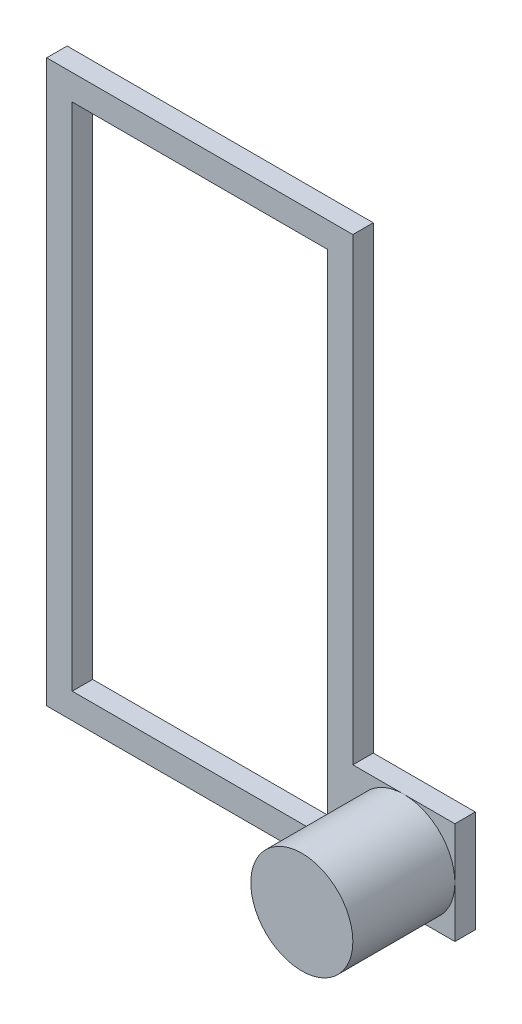
ISO-10303-21;
HEADER;
FILE_DESCRIPTION(('STEP AP214'),'2;1');
FILE_NAME('part.step','',(''),(''),'','','');
FILE_SCHEMA(('AUTOMOTIVE_DESIGN { 1 0 10303 214 1 1 1 1 }'));
ENDSEC;
DATA;
#1=APPLICATION_CONTEXT('core data for automotive mechanical design processes');
#2=APPLICATION_PROTOCOL_DEFINITION('international standard','automotive_design',2000,#1);
#3=PRODUCT_CONTEXT('',#1,'mechanical');
#4=PRODUCT('Part','Part','',(#3));
#5=PRODUCT_RELATED_PRODUCT_CATEGORY('part','',(#4));
#6=PRODUCT_DEFINITION_FORMATION('','',#4);
#7=PRODUCT_DEFINITION_CONTEXT('part definition',#1,'design');
#8=PRODUCT_DEFINITION('design','',#6,#7);
#9=PRODUCT_DEFINITION_SHAPE('','',#8);
#10=(LENGTH_UNIT() NAMED_UNIT(*) SI_UNIT(.MILLI.,.METRE.));
#11=(NAMED_UNIT(*) PLANE_ANGLE_UNIT() SI_UNIT($,.RADIAN.));
#12=(NAMED_UNIT(*) SI_UNIT($,.STERADIAN.) SOLID_ANGLE_UNIT());
#13=UNCERTAINTY_MEASURE_WITH_UNIT(LENGTH_MEASURE(1.E-05),#10,'distance_accuracy_value','');
#14=(GEOMETRIC_REPRESENTATION_CONTEXT(3) GLOBAL_UNCERTAINTY_ASSIGNED_CONTEXT((#13)) GLOBAL_UNIT_ASSIGNED_CONTEXT((#10,
#11,#12)) REPRESENTATION_CONTEXT('',''));
#15=CARTESIAN_POINT('',(0.,0.,0.));
#16=DIRECTION('',(0.,0.,1.));
#17=DIRECTION('',(1.,0.,0.));
#18=AXIS2_PLACEMENT_3D('',#15,#16,#17);
#19=CARTESIAN_POINT('',(0.,0.,2.54));
#20=DIRECTION('',(0.,0.,-1.));
#21=DIRECTION('',(-1.,0.,0.));
#22=AXIS2_PLACEMENT_3D('',#19,#20,#21);
#23=PLANE('',#22);
#24=CARTESIAN_POINT('',(25.4,-28.575,2.54));
#25=DIRECTION('',(0.,0.,1.));
#26=DIRECTION('',(1.,0.,0.));
#27=AXIS2_PLACEMENT_3D('',#24,#25,#26);
#28=CIRCLE('',#27,6.35);
#29=CARTESIAN_POINT('',(31.75,-28.575,2.54));
#30=VERTEX_POINT('',#29);
#31=CARTESIAN_POINT('',(25.4,-22.225,2.54));
#32=VERTEX_POINT('',#31);
#33=EDGE_CURVE('E48',#30,#32,#28,.T.);
#34=ORIENTED_EDGE('',*,*,#33,.F.);
#35=DIRECTION('',(0.,1.,0.));
#36=VECTOR('',#35,1.);
#37=CARTESIAN_POINT('',(31.75,-34.925,2.54));
#38=LINE('',#37,#36);
#39=CARTESIAN_POINT('',(31.75,-22.225,2.54));
#40=VERTEX_POINT('',#39);
#41=EDGE_CURVE('E130',#30,#40,#38,.T.);
#42=ORIENTED_EDGE('',*,*,#41,.T.);
#43=DIRECTION('',(1.,0.,0.));
#44=VECTOR('',#43,1.);
#45=CARTESIAN_POINT('',(19.05,-22.225,2.54));
#46=LINE('',#45,#44);
#47=EDGE_CURVE('E141',#32,#40,#46,.T.);
#48=ORIENTED_EDGE('',*,*,#47,.F.);
#49=EDGE_LOOP('',(#34,#42,#48));
#50=FACE_BOUND('',#49,.T.);
#51=ADVANCED_FACE('F37',(#50),#23,.F.);
#52=CARTESIAN_POINT('',(25.4,-34.925,2.54));
#53=VERTEX_POINT('',#52);
#54=EDGE_CURVE('E11',#32,#53,#28,.T.);
#55=ORIENTED_EDGE('',*,*,#54,.F.);
#56=CARTESIAN_POINT('',(19.05,-22.225,2.54));
#57=VERTEX_POINT('',#56);
#58=EDGE_CURVE('E139',#57,#32,#46,.T.);
#59=ORIENTED_EDGE('',*,*,#58,.F.);
#60=DIRECTION('',(0.,1.,0.));
#61=VECTOR('',#60,1.);
#62=CARTESIAN_POINT('',(19.05,-22.225,2.54));
#63=LINE('',#62,#61);
#64=CARTESIAN_POINT('',(19.05,34.925,2.54));
#65=VERTEX_POINT('',#64);
#66=EDGE_CURVE('E191',#57,#65,#63,.T.);
#67=ORIENTED_EDGE('',*,*,#66,.T.);
#68=DIRECTION('',(1.,0.,0.));
#69=VECTOR('',#68,1.);
#70=CARTESIAN_POINT('',(-19.05,34.925,2.54));
#71=LINE('',#70,#69);
#72=CARTESIAN_POINT('',(-19.05,34.925,2.54));
#73=VERTEX_POINT('',#72);
#74=EDGE_CURVE('E187',#73,#65,#71,.T.);
#75=ORIENTED_EDGE('',*,*,#74,.F.);
#76=DIRECTION('',(0.,1.,0.));
#77=VECTOR('',#76,1.);
#78=CARTESIAN_POINT('',(-19.05,-34.925,2.54));
#79=LINE('',#78,#77);
#80=CARTESIAN_POINT('',(-19.05,-34.925,2.54));
#81=VERTEX_POINT('',#80);
#82=EDGE_CURVE('E184',#81,#73,#79,.T.);
#83=ORIENTED_EDGE('',*,*,#82,.F.);
#84=DIRECTION('',(1.,0.,0.));
#85=VECTOR('',#84,1.);
#86=CARTESIAN_POINT('',(19.05,-34.925,2.54));
#87=LINE('',#86,#85);
#88=EDGE_CURVE('E194',#81,#53,#87,.T.);
#89=ORIENTED_EDGE('',*,*,#88,.T.);
#90=EDGE_LOOP('',(#55,#59,#67,#75,#83,#89));
#91=FACE_BOUND('',#90,.T.);
#92=DIRECTION('',(-1.,0.,0.));
#93=VECTOR('',#92,1.);
#94=CARTESIAN_POINT('',(-15.875,31.75,2.54));
#95=LINE('',#94,#93);
#96=CARTESIAN_POINT('',(15.875,31.75,2.54));
#97=VERTEX_POINT('',#96);
#98=CARTESIAN_POINT('',(-15.875,31.75,2.54));
#99=VERTEX_POINT('',#98);
#100=EDGE_CURVE('E167',#97,#99,#95,.T.);
#101=ORIENTED_EDGE('',*,*,#100,.F.);
#102=DIRECTION('',(0.,1.,0.));
#103=VECTOR('',#102,1.);
#104=CARTESIAN_POINT('',(15.875,-31.75,2.54));
#105=LINE('',#104,#103);
#106=CARTESIAN_POINT('',(15.875,-31.75,2.54));
#107=VERTEX_POINT('',#106);
#108=EDGE_CURVE('E165',#107,#97,#105,.T.);
#109=ORIENTED_EDGE('',*,*,#108,.F.);
#110=DIRECTION('',(1.,0.,0.));
#111=VECTOR('',#110,1.);
#112=CARTESIAN_POINT('',(-15.875,-31.75,2.54));
#113=LINE('',#112,#111);
#114=CARTESIAN_POINT('',(-15.875,-31.75,2.54));
#115=VERTEX_POINT('',#114);
#116=EDGE_CURVE('E155',#115,#107,#113,.T.);
#117=ORIENTED_EDGE('',*,*,#116,.F.);
#118=DIRECTION('',(0.,-1.,0.));
#119=VECTOR('',#118,1.);
#120=CARTESIAN_POINT('',(-15.875,-31.75,2.54));
#121=LINE('',#120,#119);
#122=EDGE_CURVE('E170',#99,#115,#121,.T.);
#123=ORIENTED_EDGE('',*,*,#122,.F.);
#124=EDGE_LOOP('',(#101,#109,#117,#123));
#125=FACE_BOUND('',#124,.T.);
#126=ADVANCED_FACE('F234',(#91,#125),#23,.F.);
#127=CARTESIAN_POINT('',(-19.05,-34.925,2.54));
#128=DIRECTION('',(-1.,0.,0.));
#129=DIRECTION('',(0.,0.,1.));
#130=AXIS2_PLACEMENT_3D('',#127,#128,#129);
#131=PLANE('',#130);
#132=DIRECTION('',(0.,1.,0.));
#133=VECTOR('',#132,1.);
#134=CARTESIAN_POINT('',(-19.05,-34.925,0.));
#135=LINE('',#134,#133);
#136=CARTESIAN_POINT('',(-19.05,-34.925,0.));
#137=VERTEX_POINT('',#136);
#138=CARTESIAN_POINT('',(-19.05,34.925,0.));
#139=VERTEX_POINT('',#138);
#140=EDGE_CURVE('E177',#137,#139,#135,.T.);
#141=ORIENTED_EDGE('',*,*,#140,.F.);
#142=DIRECTION('',(0.,0.,-1.));
#143=VECTOR('',#142,1.);
#144=CARTESIAN_POINT('',(-19.05,-34.925,2.54));
#145=LINE('',#144,#143);
#146=EDGE_CURVE('E146',#81,#137,#145,.T.);
#147=ORIENTED_EDGE('',*,*,#146,.F.);
#148=ORIENTED_EDGE('',*,*,#82,.T.);
#149=DIRECTION('',(0.,0.,-1.));
#150=VECTOR('',#149,1.);
#151=CARTESIAN_POINT('',(-19.05,34.925,2.54));
#152=LINE('',#151,#150);
#153=EDGE_CURVE('E41',#73,#139,#152,.T.);
#154=ORIENTED_EDGE('',*,*,#153,.T.);
#155=EDGE_LOOP('',(#141,#147,#148,#154));
#156=FACE_BOUND('',#155,.T.);
#157=ADVANCED_FACE('F39',(#156),#131,.T.);
#158=CARTESIAN_POINT('',(-19.05,-34.925,2.54));
#159=DIRECTION('',(0.,1.,0.));
#160=DIRECTION('',(0.,0.,1.));
#161=AXIS2_PLACEMENT_3D('',#158,#159,#160);
#162=PLANE('',#161);
#163=DIRECTION('',(1.,0.,0.));
#164=VECTOR('',#163,1.);
#165=CARTESIAN_POINT('',(-19.05,-34.925,0.));
#166=LINE('',#165,#164);
#167=CARTESIAN_POINT('',(31.75,-34.925,0.));
#168=VERTEX_POINT('',#167);
#169=EDGE_CURVE('E188',#137,#168,#166,.T.);
#170=ORIENTED_EDGE('',*,*,#169,.T.);
#171=DIRECTION('',(0.,0.,-1.));
#172=VECTOR('',#171,1.);
#173=CARTESIAN_POINT('',(31.75,-34.925,2.54));
#174=LINE('',#173,#172);
#175=CARTESIAN_POINT('',(31.75,-34.925,2.54));
#176=VERTEX_POINT('',#175);
#177=EDGE_CURVE('E147',#176,#168,#174,.T.);
#178=ORIENTED_EDGE('',*,*,#177,.F.);
#179=EDGE_CURVE('E126',#53,#176,#87,.T.);
#180=ORIENTED_EDGE('',*,*,#179,.F.);
#181=ORIENTED_EDGE('',*,*,#88,.F.);
#182=ORIENTED_EDGE('',*,*,#146,.T.);
#183=EDGE_LOOP('',(#170,#178,#180,#181,#182));
#184=FACE_BOUND('',#183,.T.);
#185=ADVANCED_FACE('F229',(#184),#162,.F.);
#186=CARTESIAN_POINT('',(31.75,-34.925,2.54));
#187=DIRECTION('',(-1.,0.,0.));
#188=DIRECTION('',(0.,0.,1.));
#189=AXIS2_PLACEMENT_3D('',#186,#187,#188);
#190=PLANE('',#189);
#191=DIRECTION('',(0.,1.,0.));
#192=VECTOR('',#191,1.);
#193=CARTESIAN_POINT('',(31.75,-34.925,0.));
#194=LINE('',#193,#192);
#195=CARTESIAN_POINT('',(31.75,-22.225,0.));
#196=VERTEX_POINT('',#195);
#197=EDGE_CURVE('E207',#168,#196,#194,.T.);
#198=ORIENTED_EDGE('',*,*,#197,.T.);
#199=DIRECTION('',(0.,0.,-1.));
#200=VECTOR('',#199,1.);
#201=CARTESIAN_POINT('',(31.75,-22.225,2.54));
#202=LINE('',#201,#200);
#203=EDGE_CURVE('E137',#40,#196,#202,.T.);
#204=ORIENTED_EDGE('',*,*,#203,.F.);
#205=ORIENTED_EDGE('',*,*,#41,.F.);
#206=EDGE_CURVE('E123',#176,#30,#38,.T.);
#207=ORIENTED_EDGE('',*,*,#206,.F.);
#208=ORIENTED_EDGE('',*,*,#177,.T.);
#209=EDGE_LOOP('',(#198,#204,#205,#207,#208));
#210=FACE_BOUND('',#209,.T.);
#211=ADVANCED_FACE('F136',(#210),#190,.F.);
#212=CARTESIAN_POINT('',(19.05,-22.225,2.54));
#213=DIRECTION('',(0.,1.,0.));
#214=DIRECTION('',(0.,0.,1.));
#215=AXIS2_PLACEMENT_3D('',#212,#213,#214);
#216=PLANE('',#215);
#217=DIRECTION('',(1.,0.,0.));
#218=VECTOR('',#217,1.);
#219=CARTESIAN_POINT('',(19.05,-22.225,0.));
#220=LINE('',#219,#218);
#221=CARTESIAN_POINT('',(19.05,-22.225,0.));
#222=VERTEX_POINT('',#221);
#223=EDGE_CURVE('E204',#222,#196,#220,.T.);
#224=ORIENTED_EDGE('',*,*,#223,.F.);
#225=DIRECTION('',(0.,0.,-1.));
#226=VECTOR('',#225,1.);
#227=CARTESIAN_POINT('',(19.05,-22.225,2.54));
#228=LINE('',#227,#226);
#229=EDGE_CURVE('E212',#57,#222,#228,.T.);
#230=ORIENTED_EDGE('',*,*,#229,.F.);
#231=ORIENTED_EDGE('',*,*,#58,.T.);
#232=ORIENTED_EDGE('',*,*,#47,.T.);
#233=ORIENTED_EDGE('',*,*,#203,.T.);
#234=EDGE_LOOP('',(#224,#230,#231,#232,#233));
#235=FACE_BOUND('',#234,.T.);
#236=ADVANCED_FACE('F232',(#235),#216,.T.);
#237=CARTESIAN_POINT('',(19.05,-22.225,2.54));
#238=DIRECTION('',(-1.,0.,0.));
#239=DIRECTION('',(0.,0.,1.));
#240=AXIS2_PLACEMENT_3D('',#237,#238,#239);
#241=PLANE('',#240);
#242=DIRECTION('',(0.,1.,0.));
#243=VECTOR('',#242,1.);
#244=CARTESIAN_POINT('',(19.05,-22.225,0.));
#245=LINE('',#244,#243);
#246=CARTESIAN_POINT('',(19.05,34.925,0.));
#247=VERTEX_POINT('',#246);
#248=EDGE_CURVE('E201',#222,#247,#245,.T.);
#249=ORIENTED_EDGE('',*,*,#248,.T.);
#250=DIRECTION('',(0.,0.,-1.));
#251=VECTOR('',#250,1.);
#252=CARTESIAN_POINT('',(19.05,34.925,2.54));
#253=LINE('',#252,#251);
#254=EDGE_CURVE('E213',#65,#247,#253,.T.);
#255=ORIENTED_EDGE('',*,*,#254,.F.);
#256=ORIENTED_EDGE('',*,*,#66,.F.);
#257=ORIENTED_EDGE('',*,*,#229,.T.);
#258=EDGE_LOOP('',(#249,#255,#256,#257));
#259=FACE_BOUND('',#258,.T.);
#260=ADVANCED_FACE('F237',(#259),#241,.F.);
#261=CARTESIAN_POINT('',(-19.05,34.925,2.54));
#262=DIRECTION('',(0.,1.,0.));
#263=DIRECTION('',(0.,0.,1.));
#264=AXIS2_PLACEMENT_3D('',#261,#262,#263);
#265=PLANE('',#264);
#266=DIRECTION('',(1.,0.,0.));
#267=VECTOR('',#266,1.);
#268=CARTESIAN_POINT('',(-19.05,34.925,0.));
#269=LINE('',#268,#267);
#270=EDGE_CURVE('E198',#139,#247,#269,.T.);
#271=ORIENTED_EDGE('',*,*,#270,.F.);
#272=ORIENTED_EDGE('',*,*,#153,.F.);
#273=ORIENTED_EDGE('',*,*,#74,.T.);
#274=ORIENTED_EDGE('',*,*,#254,.T.);
#275=EDGE_LOOP('',(#271,#272,#273,#274));
#276=FACE_BOUND('',#275,.T.);
#277=ADVANCED_FACE('F222',(#276),#265,.T.);
#278=EDGE_CURVE('E46',#53,#30,#28,.T.);
#279=ORIENTED_EDGE('',*,*,#278,.F.);
#280=ORIENTED_EDGE('',*,*,#179,.T.);
#281=ORIENTED_EDGE('',*,*,#206,.T.);
#282=EDGE_LOOP('',(#279,#280,#281));
#283=FACE_BOUND('',#282,.T.);
#284=ADVANCED_FACE('F125',(#283),#23,.F.);
#285=CARTESIAN_POINT('',(0.,0.,0.));
#286=DIRECTION('',(0.,0.,-1.));
#287=DIRECTION('',(-1.,0.,0.));
#288=AXIS2_PLACEMENT_3D('',#285,#286,#287);
#289=PLANE('',#288);
#290=DIRECTION('',(0.,1.,0.));
#291=VECTOR('',#290,1.);
#292=CARTESIAN_POINT('',(15.875,-31.75,0.));
#293=LINE('',#292,#291);
#294=CARTESIAN_POINT('',(15.875,-31.75,0.));
#295=VERTEX_POINT('',#294);
#296=CARTESIAN_POINT('',(15.875,31.75,0.));
#297=VERTEX_POINT('',#296);
#298=EDGE_CURVE('E151',#295,#297,#293,.T.);
#299=ORIENTED_EDGE('',*,*,#298,.T.);
#300=DIRECTION('',(-1.,0.,0.));
#301=VECTOR('',#300,1.);
#302=CARTESIAN_POINT('',(-15.875,31.75,0.));
#303=LINE('',#302,#301);
#304=CARTESIAN_POINT('',(-15.875,31.75,0.));
#305=VERTEX_POINT('',#304);
#306=EDGE_CURVE('E154',#297,#305,#303,.T.);
#307=ORIENTED_EDGE('',*,*,#306,.T.);
#308=DIRECTION('',(0.,-1.,0.));
#309=VECTOR('',#308,1.);
#310=CARTESIAN_POINT('',(-15.875,-31.75,0.));
#311=LINE('',#310,#309);
#312=CARTESIAN_POINT('',(-15.875,-31.75,0.));
#313=VERTEX_POINT('',#312);
#314=EDGE_CURVE('E158',#305,#313,#311,.T.);
#315=ORIENTED_EDGE('',*,*,#314,.T.);
#316=DIRECTION('',(1.,0.,0.));
#317=VECTOR('',#316,1.);
#318=CARTESIAN_POINT('',(-15.875,-31.75,0.));
#319=LINE('',#318,#317);
#320=EDGE_CURVE('E161',#313,#295,#319,.T.);
#321=ORIENTED_EDGE('',*,*,#320,.T.);
#322=EDGE_LOOP('',(#299,#307,#315,#321));
#323=FACE_BOUND('',#322,.T.);
#324=ORIENTED_EDGE('',*,*,#140,.T.);
#325=ORIENTED_EDGE('',*,*,#270,.T.);
#326=ORIENTED_EDGE('',*,*,#248,.F.);
#327=ORIENTED_EDGE('',*,*,#223,.T.);
#328=ORIENTED_EDGE('',*,*,#197,.F.);
#329=ORIENTED_EDGE('',*,*,#169,.F.);
#330=EDGE_LOOP('',(#324,#325,#326,#327,#328,#329));
#331=FACE_BOUND('',#330,.T.);
#332=ADVANCED_FACE('F226',(#323,#331),#289,.T.);
#333=CARTESIAN_POINT('',(15.875,-31.75,0.));
#334=DIRECTION('',(1.,0.,0.));
#335=DIRECTION('',(0.,0.,-1.));
#336=AXIS2_PLACEMENT_3D('',#333,#334,#335);
#337=PLANE('',#336);
#338=ORIENTED_EDGE('',*,*,#108,.T.);
#339=DIRECTION('',(0.,0.,1.));
#340=VECTOR('',#339,1.);
#341=CARTESIAN_POINT('',(15.875,31.75,0.));
#342=LINE('',#341,#340);
#343=EDGE_CURVE('E164',#297,#97,#342,.T.);
#344=ORIENTED_EDGE('',*,*,#343,.F.);
#345=ORIENTED_EDGE('',*,*,#298,.F.);
#346=DIRECTION('',(0.,0.,1.));
#347=VECTOR('',#346,1.);
#348=CARTESIAN_POINT('',(15.875,-31.75,0.));
#349=LINE('',#348,#347);
#350=EDGE_CURVE('E175',#295,#107,#349,.T.);
#351=ORIENTED_EDGE('',*,*,#350,.T.);
#352=EDGE_LOOP('',(#338,#344,#345,#351));
#353=FACE_BOUND('',#352,.T.);
#354=ADVANCED_FACE('F256',(#353),#337,.F.);
#355=CARTESIAN_POINT('',(-15.875,-31.75,0.));
#356=DIRECTION('',(0.,-1.,0.));
#357=DIRECTION('',(0.,0.,-1.));
#358=AXIS2_PLACEMENT_3D('',#355,#356,#357);
#359=PLANE('',#358);
#360=ORIENTED_EDGE('',*,*,#116,.T.);
#361=ORIENTED_EDGE('',*,*,#350,.F.);
#362=ORIENTED_EDGE('',*,*,#320,.F.);
#363=DIRECTION('',(0.,0.,1.));
#364=VECTOR('',#363,1.);
#365=CARTESIAN_POINT('',(-15.875,-31.75,0.));
#366=LINE('',#365,#364);
#367=EDGE_CURVE('E178',#313,#115,#366,.T.);
#368=ORIENTED_EDGE('',*,*,#367,.T.);
#369=EDGE_LOOP('',(#360,#361,#362,#368));
#370=FACE_BOUND('',#369,.T.);
#371=ADVANCED_FACE('F261',(#370),#359,.F.);
#372=CARTESIAN_POINT('',(-15.875,-31.75,0.));
#373=DIRECTION('',(-1.,0.,0.));
#374=DIRECTION('',(0.,0.,1.));
#375=AXIS2_PLACEMENT_3D('',#372,#373,#374);
#376=PLANE('',#375);
#377=ORIENTED_EDGE('',*,*,#122,.T.);
#378=ORIENTED_EDGE('',*,*,#367,.F.);
#379=ORIENTED_EDGE('',*,*,#314,.F.);
#380=DIRECTION('',(0.,0.,1.));
#381=VECTOR('',#380,1.);
#382=CARTESIAN_POINT('',(-15.875,31.75,0.));
#383=LINE('',#382,#381);
#384=EDGE_CURVE('E180',#305,#99,#383,.T.);
#385=ORIENTED_EDGE('',*,*,#384,.T.);
#386=EDGE_LOOP('',(#377,#378,#379,#385));
#387=FACE_BOUND('',#386,.T.);
#388=ADVANCED_FACE('F313',(#387),#376,.F.);
#389=CARTESIAN_POINT('',(-15.875,31.75,0.));
#390=DIRECTION('',(0.,1.,0.));
#391=DIRECTION('',(0.,0.,1.));
#392=AXIS2_PLACEMENT_3D('',#389,#390,#391);
#393=PLANE('',#392);
#394=ORIENTED_EDGE('',*,*,#100,.T.);
#395=ORIENTED_EDGE('',*,*,#384,.F.);
#396=ORIENTED_EDGE('',*,*,#306,.F.);
#397=ORIENTED_EDGE('',*,*,#343,.T.);
#398=EDGE_LOOP('',(#394,#395,#396,#397));
#399=FACE_BOUND('',#398,.T.);
#400=ADVANCED_FACE('F293',(#399),#393,.F.);
#401=CARTESIAN_POINT('',(25.4,-28.575,15.24));
#402=DIRECTION('',(0.,0.,-1.));
#403=DIRECTION('',(-1.,0.,0.));
#404=AXIS2_PLACEMENT_3D('',#401,#402,#403);
#405=CYLINDRICAL_SURFACE('',#404,6.35);
#406=CARTESIAN_POINT('',(25.4,-28.575,15.24));
#407=DIRECTION('',(0.,0.,1.));
#408=DIRECTION('',(1.,0.,0.));
#409=AXIS2_PLACEMENT_3D('',#406,#407,#408);
#410=CIRCLE('',#409,6.35);
#411=CARTESIAN_POINT('',(31.75,-28.575,15.24));
#412=VERTEX_POINT('',#411);
#413=EDGE_CURVE('E144',#412,#412,#410,.T.);
#414=ORIENTED_EDGE('',*,*,#413,.F.);
#415=EDGE_LOOP('',(#414));
#416=FACE_BOUND('',#415,.T.);
#417=ORIENTED_EDGE('',*,*,#33,.T.);
#418=ORIENTED_EDGE('',*,*,#54,.T.);
#419=ORIENTED_EDGE('',*,*,#278,.T.);
#420=EDGE_LOOP('',(#417,#418,#419));
#421=FACE_BOUND('',#420,.T.);
#422=ADVANCED_FACE('F145',(#416,#421),#405,.T.);
#423=CARTESIAN_POINT('',(25.4,-28.575,15.24));
#424=DIRECTION('',(0.,0.,1.));
#425=DIRECTION('',(1.,0.,0.));
#426=AXIS2_PLACEMENT_3D('',#423,#424,#425);
#427=PLANE('',#426);
#428=ORIENTED_EDGE('',*,*,#413,.T.);
#429=EDGE_LOOP('',(#428));
#430=FACE_BOUND('',#429,.T.);
#431=ADVANCED_FACE('F292',(#430),#427,.T.);
#432=CLOSED_SHELL('',(#51,#126,#157,#185,#211,#236,#260,#277,#284,#332,#354,#371,#388,#400,#422,#431));
#433=MANIFOLD_SOLID_BREP('B2',#432);
#434=ADVANCED_BREP_SHAPE_REPRESENTATION('',(#18,#433),#14);
#435=SHAPE_DEFINITION_REPRESENTATION(#9,#434);
ENDSEC;
END-ISO-10303-21;
